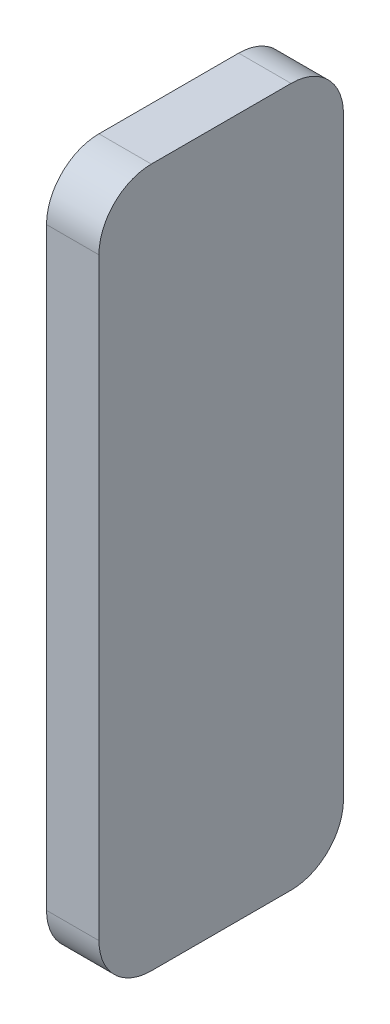
ISO-10303-21;
HEADER;
FILE_DESCRIPTION(('STEP AP214'),'2;1');
FILE_NAME('part.step','',(''),(''),'','','');
FILE_SCHEMA(('AUTOMOTIVE_DESIGN { 1 0 10303 214 1 1 1 1 }'));
ENDSEC;
DATA;
#1=APPLICATION_CONTEXT('core data for automotive mechanical design processes');
#2=APPLICATION_PROTOCOL_DEFINITION('international standard','automotive_design',2000,#1);
#3=PRODUCT_CONTEXT('',#1,'mechanical');
#4=PRODUCT('Part','Part','',(#3));
#5=PRODUCT_RELATED_PRODUCT_CATEGORY('part','',(#4));
#6=PRODUCT_DEFINITION_FORMATION('','',#4);
#7=PRODUCT_DEFINITION_CONTEXT('part definition',#1,'design');
#8=PRODUCT_DEFINITION('design','',#6,#7);
#9=PRODUCT_DEFINITION_SHAPE('','',#8);
#10=(LENGTH_UNIT() NAMED_UNIT(*) SI_UNIT(.MILLI.,.METRE.));
#11=(NAMED_UNIT(*) PLANE_ANGLE_UNIT() SI_UNIT($,.RADIAN.));
#12=(NAMED_UNIT(*) SI_UNIT($,.STERADIAN.) SOLID_ANGLE_UNIT());
#13=UNCERTAINTY_MEASURE_WITH_UNIT(LENGTH_MEASURE(1.E-05),#10,'distance_accuracy_value','');
#14=(GEOMETRIC_REPRESENTATION_CONTEXT(3) GLOBAL_UNCERTAINTY_ASSIGNED_CONTEXT((#13)) GLOBAL_UNIT_ASSIGNED_CONTEXT((#10,
#11,#12)) REPRESENTATION_CONTEXT('',''));
#15=CARTESIAN_POINT('',(0.,0.,0.));
#16=DIRECTION('',(0.,0.,1.));
#17=DIRECTION('',(1.,0.,0.));
#18=AXIS2_PLACEMENT_3D('',#15,#16,#17);
#19=CARTESIAN_POINT('',(15.,0.,-35.));
#20=DIRECTION('',(0.,0.,-1.));
#21=DIRECTION('',(-1.,0.,0.));
#22=AXIS2_PLACEMENT_3D('',#19,#20,#21);
#23=PLANE('',#22);
#24=DIRECTION('',(0.,-1.,0.));
#25=VECTOR('',#24,1.);
#26=CARTESIAN_POINT('',(15.,0.,-35.));
#27=LINE('',#26,#25);
#28=CARTESIAN_POINT('',(15.,85.,-35.));
#29=VERTEX_POINT('',#28);
#30=CARTESIAN_POINT('',(15.,-85.,-35.));
#31=VERTEX_POINT('',#30);
#32=EDGE_CURVE('E188',#29,#31,#27,.T.);
#33=ORIENTED_EDGE('',*,*,#32,.T.);
#34=DIRECTION('',(-1.,0.,0.));
#35=VECTOR('',#34,1.);
#36=CARTESIAN_POINT('',(0.,-85.,-35.));
#37=LINE('',#36,#35);
#38=CARTESIAN_POINT('',(0.,-85.,-35.));
#39=VERTEX_POINT('',#38);
#40=EDGE_CURVE('E130',#31,#39,#37,.T.);
#41=ORIENTED_EDGE('',*,*,#40,.T.);
#42=DIRECTION('',(0.,-1.,0.));
#43=VECTOR('',#42,1.);
#44=CARTESIAN_POINT('',(0.,0.,-35.));
#45=LINE('',#44,#43);
#46=CARTESIAN_POINT('',(0.,85.,-35.));
#47=VERTEX_POINT('',#46);
#48=EDGE_CURVE('E114',#47,#39,#45,.T.);
#49=ORIENTED_EDGE('',*,*,#48,.F.);
#50=DIRECTION('',(-1.,0.,0.));
#51=VECTOR('',#50,1.);
#52=CARTESIAN_POINT('',(15.,85.,-35.));
#53=LINE('',#52,#51);
#54=EDGE_CURVE('E127',#47,#29,#53,.F.);
#55=ORIENTED_EDGE('',*,*,#54,.T.);
#56=EDGE_LOOP('',(#33,#41,#49,#55));
#57=FACE_BOUND('',#56,.T.);
#58=ADVANCED_FACE('F43',(#57),#23,.T.);
#59=CARTESIAN_POINT('',(15.,100.,0.));
#60=DIRECTION('',(0.,1.,0.));
#61=DIRECTION('',(0.,0.,1.));
#62=AXIS2_PLACEMENT_3D('',#59,#60,#61);
#63=PLANE('',#62);
#64=DIRECTION('',(0.,0.,-1.));
#65=VECTOR('',#64,1.);
#66=CARTESIAN_POINT('',(15.,100.,0.));
#67=LINE('',#66,#65);
#68=CARTESIAN_POINT('',(15.,100.,20.));
#69=VERTEX_POINT('',#68);
#70=CARTESIAN_POINT('',(15.,100.,-20.));
#71=VERTEX_POINT('',#70);
#72=EDGE_CURVE('E184',#69,#71,#67,.T.);
#73=ORIENTED_EDGE('',*,*,#72,.T.);
#74=DIRECTION('',(-1.,0.,0.));
#75=VECTOR('',#74,1.);
#76=CARTESIAN_POINT('',(15.,100.,-20.));
#77=LINE('',#76,#75);
#78=CARTESIAN_POINT('',(0.,100.,-20.));
#79=VERTEX_POINT('',#78);
#80=EDGE_CURVE('E11',#71,#79,#77,.T.);
#81=ORIENTED_EDGE('',*,*,#80,.T.);
#82=DIRECTION('',(0.,0.,-1.));
#83=VECTOR('',#82,1.);
#84=CARTESIAN_POINT('',(0.,100.,0.));
#85=LINE('',#84,#83);
#86=CARTESIAN_POINT('',(0.,100.,20.));
#87=VERTEX_POINT('',#86);
#88=EDGE_CURVE('E116',#87,#79,#85,.T.);
#89=ORIENTED_EDGE('',*,*,#88,.F.);
#90=DIRECTION('',(-1.,0.,0.));
#91=VECTOR('',#90,1.);
#92=CARTESIAN_POINT('',(15.,100.,20.));
#93=LINE('',#92,#91);
#94=EDGE_CURVE('E52',#87,#69,#93,.F.);
#95=ORIENTED_EDGE('',*,*,#94,.T.);
#96=EDGE_LOOP('',(#73,#81,#89,#95));
#97=FACE_BOUND('',#96,.T.);
#98=ADVANCED_FACE('F183',(#97),#63,.T.);
#99=CARTESIAN_POINT('',(15.,0.,35.));
#100=DIRECTION('',(0.,0.,-1.));
#101=DIRECTION('',(-1.,0.,0.));
#102=AXIS2_PLACEMENT_3D('',#99,#100,#101);
#103=PLANE('',#102);
#104=DIRECTION('',(0.,-1.,0.));
#105=VECTOR('',#104,1.);
#106=CARTESIAN_POINT('',(0.,0.,35.));
#107=LINE('',#106,#105);
#108=CARTESIAN_POINT('',(0.,85.,35.));
#109=VERTEX_POINT('',#108);
#110=CARTESIAN_POINT('',(0.,-85.,35.));
#111=VERTEX_POINT('',#110);
#112=EDGE_CURVE('E193',#109,#111,#107,.T.);
#113=ORIENTED_EDGE('',*,*,#112,.T.);
#114=DIRECTION('',(-1.,0.,0.));
#115=VECTOR('',#114,1.);
#116=CARTESIAN_POINT('',(15.,-85.,35.));
#117=LINE('',#116,#115);
#118=CARTESIAN_POINT('',(15.,-85.,35.));
#119=VERTEX_POINT('',#118);
#120=EDGE_CURVE('E59',#111,#119,#117,.F.);
#121=ORIENTED_EDGE('',*,*,#120,.T.);
#122=DIRECTION('',(0.,-1.,0.));
#123=VECTOR('',#122,1.);
#124=CARTESIAN_POINT('',(15.,0.,35.));
#125=LINE('',#124,#123);
#126=CARTESIAN_POINT('',(15.,85.,35.));
#127=VERTEX_POINT('',#126);
#128=EDGE_CURVE('E144',#127,#119,#125,.T.);
#129=ORIENTED_EDGE('',*,*,#128,.F.);
#130=DIRECTION('',(-1.,0.,0.));
#131=VECTOR('',#130,1.);
#132=CARTESIAN_POINT('',(0.,85.,35.));
#133=LINE('',#132,#131);
#134=EDGE_CURVE('E174',#127,#109,#133,.T.);
#135=ORIENTED_EDGE('',*,*,#134,.T.);
#136=EDGE_LOOP('',(#113,#121,#129,#135));
#137=FACE_BOUND('',#136,.T.);
#138=ADVANCED_FACE('F192',(#137),#103,.F.);
#139=CARTESIAN_POINT('',(15.,-100.,0.));
#140=DIRECTION('',(0.,1.,0.));
#141=DIRECTION('',(0.,0.,1.));
#142=AXIS2_PLACEMENT_3D('',#139,#140,#141);
#143=PLANE('',#142);
#144=DIRECTION('',(0.,0.,-1.));
#145=VECTOR('',#144,1.);
#146=CARTESIAN_POINT('',(0.,-100.,0.));
#147=LINE('',#146,#145);
#148=CARTESIAN_POINT('',(0.,-100.,20.));
#149=VERTEX_POINT('',#148);
#150=CARTESIAN_POINT('',(0.,-100.,-20.));
#151=VERTEX_POINT('',#150);
#152=EDGE_CURVE('E147',#149,#151,#147,.T.);
#153=ORIENTED_EDGE('',*,*,#152,.T.);
#154=DIRECTION('',(-1.,0.,0.));
#155=VECTOR('',#154,1.);
#156=CARTESIAN_POINT('',(15.,-100.,-20.));
#157=LINE('',#156,#155);
#158=CARTESIAN_POINT('',(15.,-100.,-20.));
#159=VERTEX_POINT('',#158);
#160=EDGE_CURVE('E161',#151,#159,#157,.F.);
#161=ORIENTED_EDGE('',*,*,#160,.T.);
#162=DIRECTION('',(0.,0.,-1.));
#163=VECTOR('',#162,1.);
#164=CARTESIAN_POINT('',(15.,-100.,0.));
#165=LINE('',#164,#163);
#166=CARTESIAN_POINT('',(15.,-100.,20.));
#167=VERTEX_POINT('',#166);
#168=EDGE_CURVE('E138',#167,#159,#165,.T.);
#169=ORIENTED_EDGE('',*,*,#168,.F.);
#170=DIRECTION('',(-1.,0.,0.));
#171=VECTOR('',#170,1.);
#172=CARTESIAN_POINT('',(15.,-100.,20.));
#173=LINE('',#172,#171);
#174=EDGE_CURVE('E157',#167,#149,#173,.T.);
#175=ORIENTED_EDGE('',*,*,#174,.T.);
#176=EDGE_LOOP('',(#153,#161,#169,#175));
#177=FACE_BOUND('',#176,.T.);
#178=ADVANCED_FACE('F291',(#177),#143,.F.);
#179=CARTESIAN_POINT('',(15.,0.,0.));
#180=DIRECTION('',(1.,0.,0.));
#181=DIRECTION('',(0.,0.,-1.));
#182=AXIS2_PLACEMENT_3D('',#179,#180,#181);
#183=PLANE('',#182);
#184=ORIENTED_EDGE('',*,*,#168,.T.);
#185=CARTESIAN_POINT('',(15.,-85.,-20.));
#186=DIRECTION('',(1.,0.,0.));
#187=DIRECTION('',(0.,0.,-1.));
#188=AXIS2_PLACEMENT_3D('',#185,#186,#187);
#189=CIRCLE('',#188,15.);
#190=EDGE_CURVE('E171',#159,#31,#189,.T.);
#191=ORIENTED_EDGE('',*,*,#190,.T.);
#192=ORIENTED_EDGE('',*,*,#32,.F.);
#193=CARTESIAN_POINT('',(15.,85.,-20.));
#194=DIRECTION('',(1.,0.,0.));
#195=DIRECTION('',(0.,0.,-1.));
#196=AXIS2_PLACEMENT_3D('',#193,#194,#195);
#197=CIRCLE('',#196,15.);
#198=EDGE_CURVE('E136',#29,#71,#197,.T.);
#199=ORIENTED_EDGE('',*,*,#198,.T.);
#200=ORIENTED_EDGE('',*,*,#72,.F.);
#201=CARTESIAN_POINT('',(15.,85.,20.));
#202=DIRECTION('',(1.,0.,0.));
#203=DIRECTION('',(0.,0.,-1.));
#204=AXIS2_PLACEMENT_3D('',#201,#202,#203);
#205=CIRCLE('',#204,15.);
#206=EDGE_CURVE('E66',#69,#127,#205,.T.);
#207=ORIENTED_EDGE('',*,*,#206,.T.);
#208=ORIENTED_EDGE('',*,*,#128,.T.);
#209=CARTESIAN_POINT('',(15.,-85.,20.));
#210=DIRECTION('',(1.,0.,0.));
#211=DIRECTION('',(0.,0.,-1.));
#212=AXIS2_PLACEMENT_3D('',#209,#210,#211);
#213=CIRCLE('',#212,15.);
#214=EDGE_CURVE('E168',#119,#167,#213,.T.);
#215=ORIENTED_EDGE('',*,*,#214,.T.);
#216=EDGE_LOOP('',(#184,#191,#192,#199,#200,#207,#208,#215));
#217=FACE_BOUND('',#216,.T.);
#218=ADVANCED_FACE('F186',(#217),#183,.T.);
#219=CARTESIAN_POINT('',(0.,0.,0.));
#220=DIRECTION('',(1.,0.,0.));
#221=DIRECTION('',(0.,0.,-1.));
#222=AXIS2_PLACEMENT_3D('',#219,#220,#221);
#223=PLANE('',#222);
#224=CARTESIAN_POINT('',(0.,-80.,0.));
#225=DIRECTION('',(1.,0.,0.));
#226=DIRECTION('',(0.,0.,-1.));
#227=AXIS2_PLACEMENT_3D('',#224,#225,#226);
#228=CIRCLE('',#227,7.5);
#229=CARTESIAN_POINT('',(0.,-80.,-7.50000000000002));
#230=VERTEX_POINT('',#229);
#231=EDGE_CURVE('E213',#230,#230,#228,.T.);
#232=ORIENTED_EDGE('',*,*,#231,.T.);
#233=EDGE_LOOP('',(#232));
#234=FACE_BOUND('',#233,.T.);
#235=CARTESIAN_POINT('',(0.,80.,0.));
#236=DIRECTION('',(1.,0.,0.));
#237=DIRECTION('',(0.,0.,-1.));
#238=AXIS2_PLACEMENT_3D('',#235,#236,#237);
#239=CIRCLE('',#238,7.5);
#240=CARTESIAN_POINT('',(0.,80.,-7.50000000000002));
#241=VERTEX_POINT('',#240);
#242=EDGE_CURVE('E209',#241,#241,#239,.T.);
#243=ORIENTED_EDGE('',*,*,#242,.T.);
#244=EDGE_LOOP('',(#243));
#245=FACE_BOUND('',#244,.T.);
#246=ORIENTED_EDGE('',*,*,#48,.T.);
#247=CARTESIAN_POINT('',(0.,-85.,-20.));
#248=DIRECTION('',(1.,0.,0.));
#249=DIRECTION('',(0.,0.,-1.));
#250=AXIS2_PLACEMENT_3D('',#247,#248,#249);
#251=CIRCLE('',#250,15.);
#252=EDGE_CURVE('E154',#39,#151,#251,.F.);
#253=ORIENTED_EDGE('',*,*,#252,.T.);
#254=ORIENTED_EDGE('',*,*,#152,.F.);
#255=CARTESIAN_POINT('',(0.,-85.,20.));
#256=DIRECTION('',(1.,0.,0.));
#257=DIRECTION('',(0.,0.,-1.));
#258=AXIS2_PLACEMENT_3D('',#255,#256,#257);
#259=CIRCLE('',#258,15.);
#260=EDGE_CURVE('E121',#149,#111,#259,.F.);
#261=ORIENTED_EDGE('',*,*,#260,.T.);
#262=ORIENTED_EDGE('',*,*,#112,.F.);
#263=CARTESIAN_POINT('',(0.,85.,20.));
#264=DIRECTION('',(1.,0.,0.));
#265=DIRECTION('',(0.,0.,-1.));
#266=AXIS2_PLACEMENT_3D('',#263,#264,#265);
#267=CIRCLE('',#266,15.);
#268=EDGE_CURVE('E122',#109,#87,#267,.F.);
#269=ORIENTED_EDGE('',*,*,#268,.T.);
#270=ORIENTED_EDGE('',*,*,#88,.T.);
#271=CARTESIAN_POINT('',(0.,85.,-20.));
#272=DIRECTION('',(1.,0.,0.));
#273=DIRECTION('',(0.,0.,-1.));
#274=AXIS2_PLACEMENT_3D('',#271,#272,#273);
#275=CIRCLE('',#274,15.);
#276=EDGE_CURVE('E111',#79,#47,#275,.F.);
#277=ORIENTED_EDGE('',*,*,#276,.T.);
#278=EDGE_LOOP('',(#246,#253,#254,#261,#262,#269,#270,#277));
#279=FACE_BOUND('',#278,.T.);
#280=ADVANCED_FACE('F113',(#234,#245,#279),#223,.F.);
#281=CARTESIAN_POINT('',(5.,80.,0.));
#282=DIRECTION('',(-1.,0.,0.));
#283=DIRECTION('',(0.,0.,1.));
#284=AXIS2_PLACEMENT_3D('',#281,#282,#283);
#285=CYLINDRICAL_SURFACE('',#284,7.5);
#286=CARTESIAN_POINT('',(5.,80.,0.));
#287=DIRECTION('',(1.,0.,0.));
#288=DIRECTION('',(0.,0.,-1.));
#289=AXIS2_PLACEMENT_3D('',#286,#287,#288);
#290=CIRCLE('',#289,7.5);
#291=CARTESIAN_POINT('',(5.,80.,-7.50000000000002));
#292=VERTEX_POINT('',#291);
#293=EDGE_CURVE('E205',#292,#292,#290,.T.);
#294=ORIENTED_EDGE('',*,*,#293,.T.);
#295=EDGE_LOOP('',(#294));
#296=FACE_BOUND('',#295,.T.);
#297=ORIENTED_EDGE('',*,*,#242,.F.);
#298=EDGE_LOOP('',(#297));
#299=FACE_BOUND('',#298,.T.);
#300=ADVANCED_FACE('F279',(#296,#299),#285,.F.);
#301=CARTESIAN_POINT('',(5.,80.,0.));
#302=DIRECTION('',(1.,0.,0.));
#303=DIRECTION('',(0.,0.,-1.));
#304=AXIS2_PLACEMENT_3D('',#301,#302,#303);
#305=PLANE('',#304);
#306=ORIENTED_EDGE('',*,*,#293,.F.);
#307=EDGE_LOOP('',(#306));
#308=FACE_BOUND('',#307,.T.);
#309=ADVANCED_FACE('F235',(#308),#305,.F.);
#310=CARTESIAN_POINT('',(5.,-80.,0.));
#311=DIRECTION('',(-1.,0.,0.));
#312=DIRECTION('',(0.,0.,1.));
#313=AXIS2_PLACEMENT_3D('',#310,#311,#312);
#314=CYLINDRICAL_SURFACE('',#313,7.5);
#315=CARTESIAN_POINT('',(5.,-80.,0.));
#316=DIRECTION('',(1.,0.,0.));
#317=DIRECTION('',(0.,0.,-1.));
#318=AXIS2_PLACEMENT_3D('',#315,#316,#317);
#319=CIRCLE('',#318,7.5);
#320=CARTESIAN_POINT('',(5.,-80.,-7.50000000000002));
#321=VERTEX_POINT('',#320);
#322=EDGE_CURVE('E132',#321,#321,#319,.T.);
#323=ORIENTED_EDGE('',*,*,#322,.T.);
#324=EDGE_LOOP('',(#323));
#325=FACE_BOUND('',#324,.T.);
#326=ORIENTED_EDGE('',*,*,#231,.F.);
#327=EDGE_LOOP('',(#326));
#328=FACE_BOUND('',#327,.T.);
#329=ADVANCED_FACE('F221',(#325,#328),#314,.F.);
#330=CARTESIAN_POINT('',(5.,0.,0.));
#331=DIRECTION('',(1.,0.,0.));
#332=DIRECTION('',(0.,0.,-1.));
#333=AXIS2_PLACEMENT_3D('',#330,#331,#332);
#334=PLANE('',#333);
#335=ORIENTED_EDGE('',*,*,#322,.F.);
#336=EDGE_LOOP('',(#335));
#337=FACE_BOUND('',#336,.T.);
#338=ADVANCED_FACE('F224',(#337),#334,.F.);
#339=CARTESIAN_POINT('',(15.,-85.,-20.));
#340=DIRECTION('',(1.,0.,0.));
#341=DIRECTION('',(0.,0.,-1.));
#342=AXIS2_PLACEMENT_3D('',#339,#340,#341);
#343=CYLINDRICAL_SURFACE('',#342,15.);
#344=ORIENTED_EDGE('',*,*,#190,.F.);
#345=ORIENTED_EDGE('',*,*,#160,.F.);
#346=ORIENTED_EDGE('',*,*,#252,.F.);
#347=ORIENTED_EDGE('',*,*,#40,.F.);
#348=EDGE_LOOP('',(#344,#345,#346,#347));
#349=FACE_BOUND('',#348,.T.);
#350=ADVANCED_FACE('F226',(#349),#343,.T.);
#351=CARTESIAN_POINT('',(15.,-85.,20.));
#352=DIRECTION('',(-1.,0.,0.));
#353=DIRECTION('',(0.,0.,1.));
#354=AXIS2_PLACEMENT_3D('',#351,#352,#353);
#355=CYLINDRICAL_SURFACE('',#354,15.);
#356=ORIENTED_EDGE('',*,*,#214,.F.);
#357=ORIENTED_EDGE('',*,*,#120,.F.);
#358=ORIENTED_EDGE('',*,*,#260,.F.);
#359=ORIENTED_EDGE('',*,*,#174,.F.);
#360=EDGE_LOOP('',(#356,#357,#358,#359));
#361=FACE_BOUND('',#360,.T.);
#362=ADVANCED_FACE('F232',(#361),#355,.T.);
#363=CARTESIAN_POINT('',(15.,85.,-20.));
#364=DIRECTION('',(-1.,0.,0.));
#365=DIRECTION('',(0.,0.,1.));
#366=AXIS2_PLACEMENT_3D('',#363,#364,#365);
#367=CYLINDRICAL_SURFACE('',#366,15.);
#368=ORIENTED_EDGE('',*,*,#198,.F.);
#369=ORIENTED_EDGE('',*,*,#54,.F.);
#370=ORIENTED_EDGE('',*,*,#276,.F.);
#371=ORIENTED_EDGE('',*,*,#80,.F.);
#372=EDGE_LOOP('',(#368,#369,#370,#371));
#373=FACE_BOUND('',#372,.T.);
#374=ADVANCED_FACE('F135',(#373),#367,.T.);
#375=CARTESIAN_POINT('',(15.,85.,20.));
#376=DIRECTION('',(1.,0.,0.));
#377=DIRECTION('',(0.,0.,-1.));
#378=AXIS2_PLACEMENT_3D('',#375,#376,#377);
#379=CYLINDRICAL_SURFACE('',#378,15.);
#380=ORIENTED_EDGE('',*,*,#206,.F.);
#381=ORIENTED_EDGE('',*,*,#94,.F.);
#382=ORIENTED_EDGE('',*,*,#268,.F.);
#383=ORIENTED_EDGE('',*,*,#134,.F.);
#384=EDGE_LOOP('',(#380,#381,#382,#383));
#385=FACE_BOUND('',#384,.T.);
#386=ADVANCED_FACE('F45',(#385),#379,.T.);
#387=CLOSED_SHELL('',(#58,#98,#138,#178,#218,#280,#300,#309,#329,#338,#350,#362,#374,#386));
#388=MANIFOLD_SOLID_BREP('B2',#387);
#389=ADVANCED_BREP_SHAPE_REPRESENTATION('',(#18,#388),#14);
#390=SHAPE_DEFINITION_REPRESENTATION(#9,#389);
ENDSEC;
END-ISO-10303-21;
